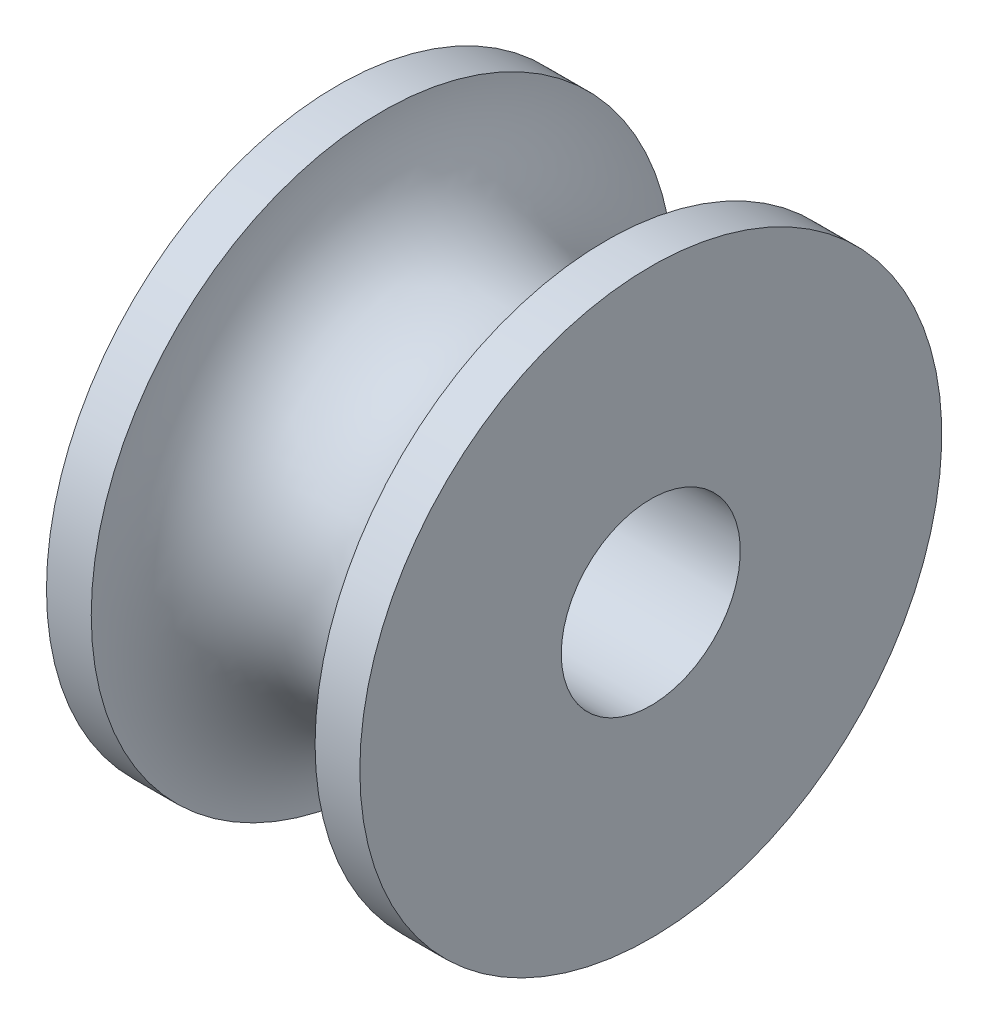
ISO-10303-21;
HEADER;
FILE_DESCRIPTION(('STEP AP214'),'2;1');
FILE_NAME('part.step','',(''),(''),'','','');
FILE_SCHEMA(('AUTOMOTIVE_DESIGN { 1 0 10303 214 1 1 1 1 }'));
ENDSEC;
DATA;
#1=APPLICATION_CONTEXT('core data for automotive mechanical design processes');
#2=APPLICATION_PROTOCOL_DEFINITION('international standard','automotive_design',2000,#1);
#3=PRODUCT_CONTEXT('',#1,'mechanical');
#4=PRODUCT('Part','Part','',(#3));
#5=PRODUCT_RELATED_PRODUCT_CATEGORY('part','',(#4));
#6=PRODUCT_DEFINITION_FORMATION('','',#4);
#7=PRODUCT_DEFINITION_CONTEXT('part definition',#1,'design');
#8=PRODUCT_DEFINITION('design','',#6,#7);
#9=PRODUCT_DEFINITION_SHAPE('','',#8);
#10=(LENGTH_UNIT() NAMED_UNIT(*) SI_UNIT(.MILLI.,.METRE.));
#11=(NAMED_UNIT(*) PLANE_ANGLE_UNIT() SI_UNIT($,.RADIAN.));
#12=(NAMED_UNIT(*) SI_UNIT($,.STERADIAN.) SOLID_ANGLE_UNIT());
#13=UNCERTAINTY_MEASURE_WITH_UNIT(LENGTH_MEASURE(1.E-05),#10,'distance_accuracy_value','');
#14=(GEOMETRIC_REPRESENTATION_CONTEXT(3) GLOBAL_UNCERTAINTY_ASSIGNED_CONTEXT((#13)) GLOBAL_UNIT_ASSIGNED_CONTEXT((#10,
#11,#12)) REPRESENTATION_CONTEXT('',''));
#15=CARTESIAN_POINT('',(0.,0.,0.));
#16=DIRECTION('',(0.,0.,1.));
#17=DIRECTION('',(1.,0.,0.));
#18=AXIS2_PLACEMENT_3D('',#15,#16,#17);
#19=CARTESIAN_POINT('',(0.,0.,0.));
#20=DIRECTION('',(-1.,0.,0.));
#21=DIRECTION('',(0.,0.,1.));
#22=AXIS2_PLACEMENT_3D('',#19,#20,#21);
#23=CYLINDRICAL_SURFACE('',#22,2.);
#24=CARTESIAN_POINT('',(3.5,0.,0.));
#25=DIRECTION('',(-1.,0.,0.));
#26=DIRECTION('',(0.,0.,1.));
#27=AXIS2_PLACEMENT_3D('',#24,#25,#26);
#28=CIRCLE('',#27,2.);
#29=CARTESIAN_POINT('',(3.5,0.,2.));
#30=VERTEX_POINT('',#29);
#31=EDGE_CURVE('E10',#30,#30,#28,.T.);
#32=ORIENTED_EDGE('',*,*,#31,.F.);
#33=EDGE_LOOP('',(#32));
#34=FACE_BOUND('',#33,.T.);
#35=CARTESIAN_POINT('',(-3.5,0.,0.));
#36=DIRECTION('',(-1.,0.,0.));
#37=DIRECTION('',(0.,0.,1.));
#38=AXIS2_PLACEMENT_3D('',#35,#36,#37);
#39=CIRCLE('',#38,2.);
#40=CARTESIAN_POINT('',(-3.5,0.,2.));
#41=VERTEX_POINT('',#40);
#42=EDGE_CURVE('E52',#41,#41,#39,.T.);
#43=ORIENTED_EDGE('',*,*,#42,.T.);
#44=EDGE_LOOP('',(#43));
#45=FACE_BOUND('',#44,.T.);
#46=ADVANCED_FACE('F30',(#34,#45),#23,.F.);
#47=CARTESIAN_POINT('',(3.5,2.,0.));
#48=DIRECTION('',(-1.,0.,0.));
#49=DIRECTION('',(0.,0.,1.));
#50=AXIS2_PLACEMENT_3D('',#47,#48,#49);
#51=PLANE('',#50);
#52=CARTESIAN_POINT('',(3.5,0.,0.));
#53=DIRECTION('',(-1.,0.,0.));
#54=DIRECTION('',(0.,0.,1.));
#55=AXIS2_PLACEMENT_3D('',#52,#53,#54);
#56=CIRCLE('',#55,6.5);
#57=CARTESIAN_POINT('',(3.5,0.,6.5));
#58=VERTEX_POINT('',#57);
#59=EDGE_CURVE('E36',#58,#58,#56,.T.);
#60=ORIENTED_EDGE('',*,*,#59,.F.);
#61=EDGE_LOOP('',(#60));
#62=FACE_BOUND('',#61,.T.);
#63=ORIENTED_EDGE('',*,*,#31,.T.);
#64=EDGE_LOOP('',(#63));
#65=FACE_BOUND('',#64,.T.);
#66=ADVANCED_FACE('F77',(#62,#65),#51,.F.);
#67=CARTESIAN_POINT('',(0.,0.,0.));
#68=DIRECTION('',(-1.,0.,0.));
#69=DIRECTION('',(0.,0.,1.));
#70=AXIS2_PLACEMENT_3D('',#67,#68,#69);
#71=CYLINDRICAL_SURFACE('',#70,6.5);
#72=CARTESIAN_POINT('',(2.5,0.,0.));
#73=DIRECTION('',(-1.,0.,0.));
#74=DIRECTION('',(0.,0.,1.));
#75=AXIS2_PLACEMENT_3D('',#72,#73,#74);
#76=CIRCLE('',#75,6.5);
#77=CARTESIAN_POINT('',(2.5,0.,6.5));
#78=VERTEX_POINT('',#77);
#79=EDGE_CURVE('E40',#78,#78,#76,.T.);
#80=ORIENTED_EDGE('',*,*,#79,.F.);
#81=EDGE_LOOP('',(#80));
#82=FACE_BOUND('',#81,.T.);
#83=ORIENTED_EDGE('',*,*,#59,.T.);
#84=EDGE_LOOP('',(#83));
#85=FACE_BOUND('',#84,.T.);
#86=ADVANCED_FACE('F72',(#82,#85),#71,.T.);
#87=CARTESIAN_POINT('',(0.,0.,0.));
#88=DIRECTION('',(-1.,0.,0.));
#89=DIRECTION('',(0.,0.,1.));
#90=AXIS2_PLACEMENT_3D('',#87,#88,#89);
#91=TOROIDAL_SURFACE('',#90,6.5,2.5);
#92=CARTESIAN_POINT('',(-2.5,0.,0.));
#93=DIRECTION('',(-1.,0.,0.));
#94=DIRECTION('',(0.,0.,1.));
#95=AXIS2_PLACEMENT_3D('',#92,#93,#94);
#96=CIRCLE('',#95,6.5);
#97=CARTESIAN_POINT('',(-2.5,0.,6.5));
#98=VERTEX_POINT('',#97);
#99=EDGE_CURVE('E44',#98,#98,#96,.T.);
#100=ORIENTED_EDGE('',*,*,#99,.F.);
#101=EDGE_LOOP('',(#100));
#102=FACE_BOUND('',#101,.T.);
#103=ORIENTED_EDGE('',*,*,#79,.T.);
#104=EDGE_LOOP('',(#103));
#105=FACE_BOUND('',#104,.T.);
#106=ADVANCED_FACE('F66',(#102,#105),#91,.F.);
#107=CARTESIAN_POINT('',(0.,0.,0.));
#108=DIRECTION('',(-1.,0.,0.));
#109=DIRECTION('',(0.,0.,1.));
#110=AXIS2_PLACEMENT_3D('',#107,#108,#109);
#111=CYLINDRICAL_SURFACE('',#110,6.5);
#112=CARTESIAN_POINT('',(-3.5,0.,0.));
#113=DIRECTION('',(-1.,0.,0.));
#114=DIRECTION('',(0.,0.,1.));
#115=AXIS2_PLACEMENT_3D('',#112,#113,#114);
#116=CIRCLE('',#115,6.5);
#117=CARTESIAN_POINT('',(-3.5,0.,6.5));
#118=VERTEX_POINT('',#117);
#119=EDGE_CURVE('E49',#118,#118,#116,.T.);
#120=ORIENTED_EDGE('',*,*,#119,.F.);
#121=EDGE_LOOP('',(#120));
#122=FACE_BOUND('',#121,.T.);
#123=ORIENTED_EDGE('',*,*,#99,.T.);
#124=EDGE_LOOP('',(#123));
#125=FACE_BOUND('',#124,.T.);
#126=ADVANCED_FACE('F60',(#122,#125),#111,.T.);
#127=CARTESIAN_POINT('',(-3.5,2.,0.));
#128=DIRECTION('',(1.,0.,0.));
#129=DIRECTION('',(0.,0.,-1.));
#130=AXIS2_PLACEMENT_3D('',#127,#128,#129);
#131=PLANE('',#130);
#132=ORIENTED_EDGE('',*,*,#42,.F.);
#133=EDGE_LOOP('',(#132));
#134=FACE_BOUND('',#133,.T.);
#135=ORIENTED_EDGE('',*,*,#119,.T.);
#136=EDGE_LOOP('',(#135));
#137=FACE_BOUND('',#136,.T.);
#138=ADVANCED_FACE('F57',(#134,#137),#131,.F.);
#139=CLOSED_SHELL('',(#46,#66,#86,#106,#126,#138));
#140=MANIFOLD_SOLID_BREP('B2',#139);
#141=ADVANCED_BREP_SHAPE_REPRESENTATION('',(#18,#140),#14);
#142=SHAPE_DEFINITION_REPRESENTATION(#9,#141);
ENDSEC;
END-ISO-10303-21;
